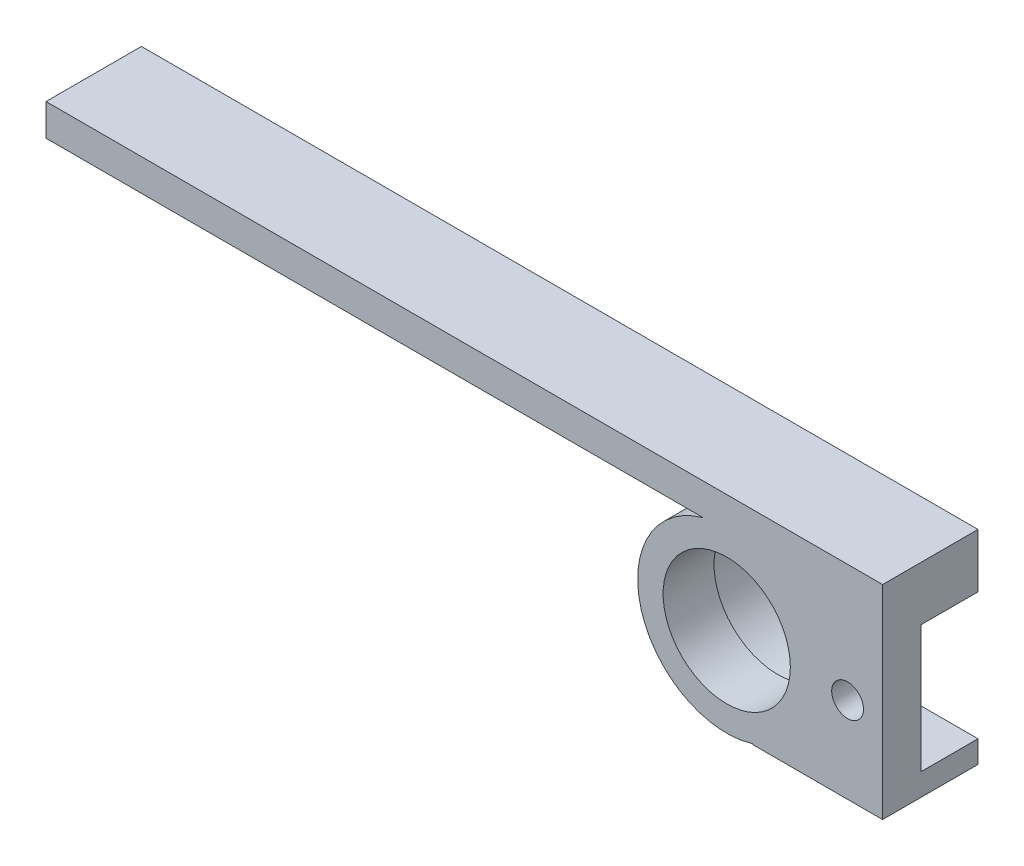
ISO-10303-21;
HEADER;
FILE_DESCRIPTION(('STEP AP214'),'2;1');
FILE_NAME('part.step','',(''),(''),'','','');
FILE_SCHEMA(('AUTOMOTIVE_DESIGN { 1 0 10303 214 1 1 1 1 }'));
ENDSEC;
DATA;
#1=APPLICATION_CONTEXT('core data for automotive mechanical design processes');
#2=APPLICATION_PROTOCOL_DEFINITION('international standard','automotive_design',2000,#1);
#3=PRODUCT_CONTEXT('',#1,'mechanical');
#4=PRODUCT('Part','Part','',(#3));
#5=PRODUCT_RELATED_PRODUCT_CATEGORY('part','',(#4));
#6=PRODUCT_DEFINITION_FORMATION('','',#4);
#7=PRODUCT_DEFINITION_CONTEXT('part definition',#1,'design');
#8=PRODUCT_DEFINITION('design','',#6,#7);
#9=PRODUCT_DEFINITION_SHAPE('','',#8);
#10=(LENGTH_UNIT() NAMED_UNIT(*) SI_UNIT(.MILLI.,.METRE.));
#11=(NAMED_UNIT(*) PLANE_ANGLE_UNIT() SI_UNIT($,.RADIAN.));
#12=(NAMED_UNIT(*) SI_UNIT($,.STERADIAN.) SOLID_ANGLE_UNIT());
#13=UNCERTAINTY_MEASURE_WITH_UNIT(LENGTH_MEASURE(1.E-05),#10,'distance_accuracy_value','');
#14=(GEOMETRIC_REPRESENTATION_CONTEXT(3) GLOBAL_UNCERTAINTY_ASSIGNED_CONTEXT((#13)) GLOBAL_UNIT_ASSIGNED_CONTEXT((#10,
#11,#12)) REPRESENTATION_CONTEXT('',''));
#15=CARTESIAN_POINT('',(0.,0.,0.));
#16=DIRECTION('',(0.,0.,1.));
#17=DIRECTION('',(1.,0.,0.));
#18=AXIS2_PLACEMENT_3D('',#15,#16,#17);
#19=CARTESIAN_POINT('',(-31.,0.,-9.));
#20=DIRECTION('',(0.,0.,1.));
#21=DIRECTION('',(1.,0.,0.));
#22=AXIS2_PLACEMENT_3D('',#19,#20,#21);
#23=CYLINDRICAL_SURFACE('',#22,11.);
#24=CARTESIAN_POINT('',(-31.,0.,-9.));
#25=DIRECTION('',(0.,0.,1.));
#26=DIRECTION('',(1.,0.,0.));
#27=AXIS2_PLACEMENT_3D('',#24,#25,#26);
#28=CIRCLE('',#27,11.);
#29=CARTESIAN_POINT('',(-20.,0.,-9.));
#30=VERTEX_POINT('',#29);
#31=EDGE_CURVE('E176',#30,#30,#28,.T.);
#32=ORIENTED_EDGE('',*,*,#31,.F.);
#33=EDGE_LOOP('',(#32));
#34=FACE_BOUND('',#33,.T.);
#35=CARTESIAN_POINT('',(-31.,0.,-2.));
#36=DIRECTION('',(0.,0.,1.));
#37=DIRECTION('',(1.,0.,0.));
#38=AXIS2_PLACEMENT_3D('',#35,#36,#37);
#39=CIRCLE('',#38,11.);
#40=CARTESIAN_POINT('',(-20.,0.,-2.));
#41=VERTEX_POINT('',#40);
#42=EDGE_CURVE('E11',#41,#41,#39,.F.);
#43=ORIENTED_EDGE('',*,*,#42,.F.);
#44=EDGE_LOOP('',(#43));
#45=FACE_BOUND('',#44,.T.);
#46=ADVANCED_FACE('F45',(#34,#45),#23,.F.);
#47=CARTESIAN_POINT('',(0.,0.,6.));
#48=DIRECTION('',(0.,0.,1.));
#49=DIRECTION('',(1.,0.,0.));
#50=AXIS2_PLACEMENT_3D('',#47,#48,#49);
#51=PLANE('',#50);
#52=DIRECTION('',(0.,1.,0.));
#53=VECTOR('',#52,1.);
#54=CARTESIAN_POINT('',(-138.015626302122,0.,6.));
#55=LINE('',#54,#53);
#56=CARTESIAN_POINT('',(-138.015626302122,13.5,6.));
#57=VERTEX_POINT('',#56);
#58=CARTESIAN_POINT('',(-138.015626302122,18.5,6.));
#59=VERTEX_POINT('',#58);
#60=EDGE_CURVE('E60',#57,#59,#55,.T.);
#61=ORIENTED_EDGE('',*,*,#60,.F.);
#62=DIRECTION('',(1.,0.,0.));
#63=VECTOR('',#62,1.);
#64=CARTESIAN_POINT('',(-480.,13.5,6.));
#65=LINE('',#64,#63);
#66=CARTESIAN_POINT('',(-34.7080992435478,13.5,6.));
#67=VERTEX_POINT('',#66);
#68=EDGE_CURVE('E161',#57,#67,#65,.T.);
#69=ORIENTED_EDGE('',*,*,#68,.T.);
#70=CARTESIAN_POINT('',(-31.,0.,6.));
#71=DIRECTION('',(0.,0.,1.));
#72=DIRECTION('',(1.,0.,0.));
#73=AXIS2_PLACEMENT_3D('',#70,#71,#72);
#74=CIRCLE('',#73,14.);
#75=CARTESIAN_POINT('',(-26.8939671408107,-13.3843376436512,6.));
#76=VERTEX_POINT('',#75);
#77=EDGE_CURVE('E173',#67,#76,#74,.T.);
#78=ORIENTED_EDGE('',*,*,#77,.T.);
#79=DIRECTION('',(0.,1.,0.));
#80=VECTOR('',#79,1.);
#81=CARTESIAN_POINT('',(-26.8939671408107,0.,6.));
#82=LINE('',#81,#80);
#83=CARTESIAN_POINT('',(-26.8939671408107,-13.5,6.));
#84=VERTEX_POINT('',#83);
#85=EDGE_CURVE('E202',#84,#76,#82,.T.);
#86=ORIENTED_EDGE('',*,*,#85,.F.);
#87=DIRECTION('',(-1.,0.,0.));
#88=VECTOR('',#87,1.);
#89=CARTESIAN_POINT('',(0.,-13.5,6.));
#90=LINE('',#89,#88);
#91=CARTESIAN_POINT('',(-6.5,-13.5,6.));
#92=VERTEX_POINT('',#91);
#93=EDGE_CURVE('E180',#92,#84,#90,.T.);
#94=ORIENTED_EDGE('',*,*,#93,.F.);
#95=DIRECTION('',(0.,-1.,0.));
#96=VECTOR('',#95,1.);
#97=CARTESIAN_POINT('',(-6.5,18.5,6.));
#98=LINE('',#97,#96);
#99=CARTESIAN_POINT('',(-6.5,18.5,6.));
#100=VERTEX_POINT('',#99);
#101=EDGE_CURVE('E363',#100,#92,#98,.T.);
#102=ORIENTED_EDGE('',*,*,#101,.F.);
#103=DIRECTION('',(1.,0.,0.));
#104=VECTOR('',#103,1.);
#105=CARTESIAN_POINT('',(-480.,18.5,6.));
#106=LINE('',#105,#104);
#107=EDGE_CURVE('E157',#59,#100,#106,.T.);
#108=ORIENTED_EDGE('',*,*,#107,.F.);
#109=EDGE_LOOP('',(#61,#69,#78,#86,#94,#102,#108));
#110=FACE_BOUND('',#109,.T.);
#111=CARTESIAN_POINT('',(-12.,-1.53625178909098E-13,6.));
#112=DIRECTION('',(0.,0.,1.));
#113=DIRECTION('',(1.,0.,0.));
#114=AXIS2_PLACEMENT_3D('',#111,#112,#113);
#115=CIRCLE('',#114,2.5);
#116=CARTESIAN_POINT('',(-9.5,-1.53625178909098E-13,6.));
#117=VERTEX_POINT('',#116);
#118=EDGE_CURVE('E224',#117,#117,#115,.T.);
#119=ORIENTED_EDGE('',*,*,#118,.F.);
#120=EDGE_LOOP('',(#119));
#121=FACE_BOUND('',#120,.T.);
#122=CARTESIAN_POINT('',(-31.,0.,6.));
#123=DIRECTION('',(0.,0.,1.));
#124=DIRECTION('',(1.,0.,0.));
#125=AXIS2_PLACEMENT_3D('',#122,#123,#124);
#126=CIRCLE('',#125,10.);
#127=CARTESIAN_POINT('',(-21.,0.,6.));
#128=VERTEX_POINT('',#127);
#129=EDGE_CURVE('E169',#128,#128,#126,.T.);
#130=ORIENTED_EDGE('',*,*,#129,.F.);
#131=EDGE_LOOP('',(#130));
#132=FACE_BOUND('',#131,.T.);
#133=ADVANCED_FACE('F278',(#110,#121,#132),#51,.T.);
#134=CARTESIAN_POINT('',(0.,0.,0.));
#135=DIRECTION('',(0.,0.,1.));
#136=DIRECTION('',(1.,0.,0.));
#137=AXIS2_PLACEMENT_3D('',#134,#135,#136);
#138=PLANE('',#137);
#139=CARTESIAN_POINT('',(-12.,-1.53625178909098E-13,0.));
#140=DIRECTION('',(0.,0.,1.));
#141=DIRECTION('',(1.,0.,0.));
#142=AXIS2_PLACEMENT_3D('',#139,#140,#141);
#143=CIRCLE('',#142,2.5);
#144=CARTESIAN_POINT('',(-9.5,-1.53625178909098E-13,0.));
#145=VERTEX_POINT('',#144);
#146=EDGE_CURVE('E209',#145,#145,#143,.T.);
#147=ORIENTED_EDGE('',*,*,#146,.T.);
#148=EDGE_LOOP('',(#147));
#149=FACE_BOUND('',#148,.T.);
#150=DIRECTION('',(-1.,0.,0.));
#151=VECTOR('',#150,1.);
#152=CARTESIAN_POINT('',(20.,10.,0.));
#153=LINE('',#152,#151);
#154=CARTESIAN_POINT('',(-6.5,10.,0.));
#155=VERTEX_POINT('',#154);
#156=CARTESIAN_POINT('',(-20.,10.,0.));
#157=VERTEX_POINT('',#156);
#158=EDGE_CURVE('E236',#155,#157,#153,.T.);
#159=ORIENTED_EDGE('',*,*,#158,.F.);
#160=DIRECTION('',(0.,-1.,0.));
#161=VECTOR('',#160,1.);
#162=CARTESIAN_POINT('',(-6.5,0.,0.));
#163=LINE('',#162,#161);
#164=CARTESIAN_POINT('',(-6.5,-10.,0.));
#165=VERTEX_POINT('',#164);
#166=EDGE_CURVE('E258',#155,#165,#163,.T.);
#167=ORIENTED_EDGE('',*,*,#166,.T.);
#168=DIRECTION('',(1.,0.,0.));
#169=VECTOR('',#168,1.);
#170=CARTESIAN_POINT('',(20.,-10.,0.));
#171=LINE('',#170,#169);
#172=CARTESIAN_POINT('',(-20.,-10.,0.));
#173=VERTEX_POINT('',#172);
#174=EDGE_CURVE('E233',#173,#165,#171,.T.);
#175=ORIENTED_EDGE('',*,*,#174,.F.);
#176=DIRECTION('',(0.,-1.,0.));
#177=VECTOR('',#176,1.);
#178=CARTESIAN_POINT('',(-20.,-10.,0.));
#179=LINE('',#178,#177);
#180=CARTESIAN_POINT('',(-20.,-8.66025403784439,0.));
#181=VERTEX_POINT('',#180);
#182=EDGE_CURVE('E227',#181,#173,#179,.T.);
#183=ORIENTED_EDGE('',*,*,#182,.F.);
#184=CARTESIAN_POINT('',(-31.,0.,0.));
#185=DIRECTION('',(0.,0.,1.));
#186=DIRECTION('',(1.,0.,0.));
#187=AXIS2_PLACEMENT_3D('',#184,#185,#186);
#188=CIRCLE('',#187,14.);
#189=CARTESIAN_POINT('',(-20.,8.66025403784439,0.));
#190=VERTEX_POINT('',#189);
#191=EDGE_CURVE('E53',#181,#190,#188,.T.);
#192=ORIENTED_EDGE('',*,*,#191,.T.);
#193=EDGE_CURVE('E230',#157,#190,#179,.T.);
#194=ORIENTED_EDGE('',*,*,#193,.F.);
#195=EDGE_LOOP('',(#159,#167,#175,#183,#192,#194));
#196=FACE_BOUND('',#195,.T.);
#197=ADVANCED_FACE('F47',(#149,#196),#138,.F.);
#198=CARTESIAN_POINT('',(-12.,-1.53625178909098E-13,0.));
#199=DIRECTION('',(0.,0.,1.));
#200=DIRECTION('',(1.,0.,0.));
#201=AXIS2_PLACEMENT_3D('',#198,#199,#200);
#202=CYLINDRICAL_SURFACE('',#201,2.5);
#203=ORIENTED_EDGE('',*,*,#146,.F.);
#204=EDGE_LOOP('',(#203));
#205=FACE_BOUND('',#204,.T.);
#206=ORIENTED_EDGE('',*,*,#118,.T.);
#207=EDGE_LOOP('',(#206));
#208=FACE_BOUND('',#207,.T.);
#209=ADVANCED_FACE('F274',(#205,#208),#202,.F.);
#210=CARTESIAN_POINT('',(-31.,0.,-9.));
#211=DIRECTION('',(0.,0.,1.));
#212=DIRECTION('',(1.,0.,0.));
#213=AXIS2_PLACEMENT_3D('',#210,#211,#212);
#214=CYLINDRICAL_SURFACE('',#213,14.);
#215=ORIENTED_EDGE('',*,*,#191,.F.);
#216=DIRECTION('',(0.,0.,1.));
#217=VECTOR('',#216,1.);
#218=CARTESIAN_POINT('',(-20.,-8.66025403784439,-9.));
#219=LINE('',#218,#217);
#220=CARTESIAN_POINT('',(-20.,-8.66025403784439,-9.));
#221=VERTEX_POINT('',#220);
#222=EDGE_CURVE('E206',#221,#181,#219,.T.);
#223=ORIENTED_EDGE('',*,*,#222,.F.);
#224=CARTESIAN_POINT('',(-31.,0.,-9.));
#225=DIRECTION('',(0.,0.,1.));
#226=DIRECTION('',(1.,0.,0.));
#227=AXIS2_PLACEMENT_3D('',#224,#225,#226);
#228=CIRCLE('',#227,14.);
#229=CARTESIAN_POINT('',(-20.,8.66025403784439,-9.));
#230=VERTEX_POINT('',#229);
#231=EDGE_CURVE('E179',#221,#230,#228,.T.);
#232=ORIENTED_EDGE('',*,*,#231,.T.);
#233=DIRECTION('',(0.,0.,1.));
#234=VECTOR('',#233,1.);
#235=CARTESIAN_POINT('',(-20.,8.66025403784439,-9.));
#236=LINE('',#235,#234);
#237=EDGE_CURVE('E200',#230,#190,#236,.T.);
#238=ORIENTED_EDGE('',*,*,#237,.T.);
#239=EDGE_LOOP('',(#215,#223,#232,#238));
#240=FACE_BOUND('',#239,.T.);
#241=ADVANCED_FACE('F248',(#240),#214,.T.);
#242=CARTESIAN_POINT('',(-20.,0.,-9.));
#243=DIRECTION('',(-1.,0.,0.));
#244=DIRECTION('',(0.,0.,1.));
#245=AXIS2_PLACEMENT_3D('',#242,#243,#244);
#246=PLANE('',#245);
#247=ORIENTED_EDGE('',*,*,#222,.T.);
#248=ORIENTED_EDGE('',*,*,#182,.T.);
#249=DIRECTION('',(0.,0.,1.));
#250=VECTOR('',#249,1.);
#251=CARTESIAN_POINT('',(-20.,-10.,-9.));
#252=LINE('',#251,#250);
#253=CARTESIAN_POINT('',(-20.,-10.,-9.));
#254=VERTEX_POINT('',#253);
#255=EDGE_CURVE('E210',#254,#173,#252,.T.);
#256=ORIENTED_EDGE('',*,*,#255,.F.);
#257=DIRECTION('',(0.,-1.,0.));
#258=VECTOR('',#257,1.);
#259=CARTESIAN_POINT('',(-20.,0.,-9.));
#260=LINE('',#259,#258);
#261=EDGE_CURVE('E197',#221,#254,#260,.T.);
#262=ORIENTED_EDGE('',*,*,#261,.F.);
#263=EDGE_LOOP('',(#247,#248,#256,#262));
#264=FACE_BOUND('',#263,.T.);
#265=ADVANCED_FACE('F265',(#264),#246,.F.);
#266=CARTESIAN_POINT('',(0.,-10.,-9.));
#267=DIRECTION('',(0.,-1.,0.));
#268=DIRECTION('',(1.,0.,0.));
#269=AXIS2_PLACEMENT_3D('',#266,#267,#268);
#270=PLANE('',#269);
#271=ORIENTED_EDGE('',*,*,#174,.T.);
#272=DIRECTION('',(0.,0.,-1.));
#273=VECTOR('',#272,1.);
#274=CARTESIAN_POINT('',(-6.5,-10.,-9.));
#275=LINE('',#274,#273);
#276=CARTESIAN_POINT('',(-6.5,-10.,-9.));
#277=VERTEX_POINT('',#276);
#278=EDGE_CURVE('E166',#165,#277,#275,.T.);
#279=ORIENTED_EDGE('',*,*,#278,.T.);
#280=DIRECTION('',(1.,0.,0.));
#281=VECTOR('',#280,1.);
#282=CARTESIAN_POINT('',(0.,-10.,-9.));
#283=LINE('',#282,#281);
#284=EDGE_CURVE('E194',#254,#277,#283,.T.);
#285=ORIENTED_EDGE('',*,*,#284,.F.);
#286=ORIENTED_EDGE('',*,*,#255,.T.);
#287=EDGE_LOOP('',(#271,#279,#285,#286));
#288=FACE_BOUND('',#287,.T.);
#289=ADVANCED_FACE('F263',(#288),#270,.F.);
#290=CARTESIAN_POINT('',(0.,10.,-9.));
#291=DIRECTION('',(0.,1.,0.));
#292=DIRECTION('',(-1.,0.,0.));
#293=AXIS2_PLACEMENT_3D('',#290,#291,#292);
#294=PLANE('',#293);
#295=DIRECTION('',(-1.,0.,0.));
#296=VECTOR('',#295,1.);
#297=CARTESIAN_POINT('',(0.,10.,-9.));
#298=LINE('',#297,#296);
#299=CARTESIAN_POINT('',(-6.5,10.,-9.));
#300=VERTEX_POINT('',#299);
#301=CARTESIAN_POINT('',(-20.,10.,-9.));
#302=VERTEX_POINT('',#301);
#303=EDGE_CURVE('E185',#300,#302,#298,.T.);
#304=ORIENTED_EDGE('',*,*,#303,.F.);
#305=DIRECTION('',(0.,0.,1.));
#306=VECTOR('',#305,1.);
#307=CARTESIAN_POINT('',(-6.5,10.,-9.));
#308=LINE('',#307,#306);
#309=EDGE_CURVE('E256',#300,#155,#308,.T.);
#310=ORIENTED_EDGE('',*,*,#309,.T.);
#311=ORIENTED_EDGE('',*,*,#158,.T.);
#312=DIRECTION('',(0.,0.,1.));
#313=VECTOR('',#312,1.);
#314=CARTESIAN_POINT('',(-20.,10.,-9.));
#315=LINE('',#314,#313);
#316=EDGE_CURVE('E219',#302,#157,#315,.T.);
#317=ORIENTED_EDGE('',*,*,#316,.F.);
#318=EDGE_LOOP('',(#304,#310,#311,#317));
#319=FACE_BOUND('',#318,.T.);
#320=ADVANCED_FACE('F254',(#319),#294,.F.);
#321=CARTESIAN_POINT('',(-20.,0.,-9.));
#322=DIRECTION('',(-1.,0.,0.));
#323=DIRECTION('',(0.,0.,1.));
#324=AXIS2_PLACEMENT_3D('',#321,#322,#323);
#325=PLANE('',#324);
#326=ORIENTED_EDGE('',*,*,#316,.T.);
#327=ORIENTED_EDGE('',*,*,#193,.T.);
#328=ORIENTED_EDGE('',*,*,#237,.F.);
#329=DIRECTION('',(0.,-1.,0.));
#330=VECTOR('',#329,1.);
#331=CARTESIAN_POINT('',(-20.,0.,-9.));
#332=LINE('',#331,#330);
#333=EDGE_CURVE('E183',#302,#230,#332,.T.);
#334=ORIENTED_EDGE('',*,*,#333,.F.);
#335=EDGE_LOOP('',(#326,#327,#328,#334));
#336=FACE_BOUND('',#335,.T.);
#337=ADVANCED_FACE('F245',(#336),#325,.F.);
#338=CARTESIAN_POINT('',(0.,-13.5,-9.));
#339=DIRECTION('',(0.,1.,0.));
#340=DIRECTION('',(0.,0.,1.));
#341=AXIS2_PLACEMENT_3D('',#338,#339,#340);
#342=PLANE('',#341);
#343=DIRECTION('',(-1.,0.,0.));
#344=VECTOR('',#343,1.);
#345=CARTESIAN_POINT('',(0.,-13.5,-9.));
#346=LINE('',#345,#344);
#347=CARTESIAN_POINT('',(-6.5,-13.5,-9.));
#348=VERTEX_POINT('',#347);
#349=CARTESIAN_POINT('',(-26.8939671408107,-13.5,-9.));
#350=VERTEX_POINT('',#349);
#351=EDGE_CURVE('E192',#348,#350,#346,.T.);
#352=ORIENTED_EDGE('',*,*,#351,.F.);
#353=DIRECTION('',(0.,0.,1.));
#354=VECTOR('',#353,1.);
#355=CARTESIAN_POINT('',(-6.5,-13.5,-9.));
#356=LINE('',#355,#354);
#357=EDGE_CURVE('E351',#348,#92,#356,.T.);
#358=ORIENTED_EDGE('',*,*,#357,.T.);
#359=ORIENTED_EDGE('',*,*,#93,.T.);
#360=DIRECTION('',(0.,0.,1.));
#361=VECTOR('',#360,1.);
#362=CARTESIAN_POINT('',(-26.8939671408107,-13.5,-9.));
#363=LINE('',#362,#361);
#364=EDGE_CURVE('E213',#350,#84,#363,.T.);
#365=ORIENTED_EDGE('',*,*,#364,.F.);
#366=EDGE_LOOP('',(#352,#358,#359,#365));
#367=FACE_BOUND('',#366,.T.);
#368=ADVANCED_FACE('F332',(#367),#342,.F.);
#369=CARTESIAN_POINT('',(-26.8939671408107,0.,-9.));
#370=DIRECTION('',(1.,0.,0.));
#371=DIRECTION('',(0.,0.,-1.));
#372=AXIS2_PLACEMENT_3D('',#369,#370,#371);
#373=PLANE('',#372);
#374=ORIENTED_EDGE('',*,*,#85,.T.);
#375=DIRECTION('',(0.,0.,1.));
#376=VECTOR('',#375,1.);
#377=CARTESIAN_POINT('',(-26.8939671408107,-13.3843376436512,-9.));
#378=LINE('',#377,#376);
#379=CARTESIAN_POINT('',(-26.8939671408107,-13.3843376436512,-9.));
#380=VERTEX_POINT('',#379);
#381=EDGE_CURVE('E216',#380,#76,#378,.T.);
#382=ORIENTED_EDGE('',*,*,#381,.F.);
#383=DIRECTION('',(0.,1.,0.));
#384=VECTOR('',#383,1.);
#385=CARTESIAN_POINT('',(-26.8939671408107,0.,-9.));
#386=LINE('',#385,#384);
#387=EDGE_CURVE('E189',#350,#380,#386,.T.);
#388=ORIENTED_EDGE('',*,*,#387,.F.);
#389=ORIENTED_EDGE('',*,*,#364,.T.);
#390=EDGE_LOOP('',(#374,#382,#388,#389));
#391=FACE_BOUND('',#390,.T.);
#392=ADVANCED_FACE('F326',(#391),#373,.F.);
#393=CARTESIAN_POINT('',(-31.,0.,-9.));
#394=DIRECTION('',(0.,0.,1.));
#395=DIRECTION('',(1.,0.,0.));
#396=AXIS2_PLACEMENT_3D('',#393,#394,#395);
#397=CYLINDRICAL_SURFACE('',#396,14.);
#398=DIRECTION('',(0.,0.,1.));
#399=VECTOR('',#398,1.);
#400=CARTESIAN_POINT('',(-34.7080992435478,13.5,-9.));
#401=LINE('',#400,#399);
#402=CARTESIAN_POINT('',(-34.7080992435478,13.5,-9.));
#403=VERTEX_POINT('',#402);
#404=EDGE_CURVE('E159',#403,#67,#401,.T.);
#405=ORIENTED_EDGE('',*,*,#404,.F.);
#406=CARTESIAN_POINT('',(-31.,0.,-9.));
#407=DIRECTION('',(0.,0.,1.));
#408=DIRECTION('',(1.,0.,0.));
#409=AXIS2_PLACEMENT_3D('',#406,#407,#408);
#410=CIRCLE('',#409,14.);
#411=EDGE_CURVE('E187',#403,#380,#410,.T.);
#412=ORIENTED_EDGE('',*,*,#411,.T.);
#413=ORIENTED_EDGE('',*,*,#381,.T.);
#414=ORIENTED_EDGE('',*,*,#77,.F.);
#415=EDGE_LOOP('',(#405,#412,#413,#414));
#416=FACE_BOUND('',#415,.T.);
#417=ADVANCED_FACE('F322',(#416),#397,.T.);
#418=CARTESIAN_POINT('',(0.,0.,-9.));
#419=DIRECTION('',(0.,0.,1.));
#420=DIRECTION('',(1.,0.,0.));
#421=AXIS2_PLACEMENT_3D('',#418,#419,#420);
#422=PLANE('',#421);
#423=DIRECTION('',(1.,0.,0.));
#424=VECTOR('',#423,1.);
#425=CARTESIAN_POINT('',(-480.,13.5,-9.));
#426=LINE('',#425,#424);
#427=CARTESIAN_POINT('',(-138.015626302122,13.5,-9.));
#428=VERTEX_POINT('',#427);
#429=EDGE_CURVE('E151',#428,#403,#426,.T.);
#430=ORIENTED_EDGE('',*,*,#429,.F.);
#431=DIRECTION('',(0.,1.,0.));
#432=VECTOR('',#431,1.);
#433=CARTESIAN_POINT('',(-138.015626302122,0.,-9.));
#434=LINE('',#433,#432);
#435=CARTESIAN_POINT('',(-138.015626302122,18.5,-9.));
#436=VERTEX_POINT('',#435);
#437=EDGE_CURVE('E141',#428,#436,#434,.T.);
#438=ORIENTED_EDGE('',*,*,#437,.T.);
#439=DIRECTION('',(1.,0.,0.));
#440=VECTOR('',#439,1.);
#441=CARTESIAN_POINT('',(-480.,18.5,-9.));
#442=LINE('',#441,#440);
#443=CARTESIAN_POINT('',(-6.50000000000001,18.5,-9.));
#444=VERTEX_POINT('',#443);
#445=EDGE_CURVE('E68',#436,#444,#442,.T.);
#446=ORIENTED_EDGE('',*,*,#445,.T.);
#447=DIRECTION('',(0.,-1.,0.));
#448=VECTOR('',#447,1.);
#449=CARTESIAN_POINT('',(-6.5,18.5,-9.));
#450=LINE('',#449,#448);
#451=EDGE_CURVE('E364',#444,#300,#450,.T.);
#452=ORIENTED_EDGE('',*,*,#451,.T.);
#453=ORIENTED_EDGE('',*,*,#303,.T.);
#454=ORIENTED_EDGE('',*,*,#333,.T.);
#455=ORIENTED_EDGE('',*,*,#231,.F.);
#456=ORIENTED_EDGE('',*,*,#261,.T.);
#457=ORIENTED_EDGE('',*,*,#284,.T.);
#458=EDGE_CURVE('E356',#277,#348,#450,.T.);
#459=ORIENTED_EDGE('',*,*,#458,.T.);
#460=ORIENTED_EDGE('',*,*,#351,.T.);
#461=ORIENTED_EDGE('',*,*,#387,.T.);
#462=ORIENTED_EDGE('',*,*,#411,.F.);
#463=EDGE_LOOP('',(#430,#438,#446,#452,#453,#454,#455,#456,#457,#459,#460,#461,#462));
#464=FACE_BOUND('',#463,.T.);
#465=ORIENTED_EDGE('',*,*,#31,.T.);
#466=EDGE_LOOP('',(#465));
#467=FACE_BOUND('',#466,.T.);
#468=ADVANCED_FACE('F148',(#464,#467),#422,.F.);
#469=CARTESIAN_POINT('',(-31.,0.,-2.));
#470=DIRECTION('',(0.,0.,1.));
#471=DIRECTION('',(1.,0.,0.));
#472=AXIS2_PLACEMENT_3D('',#469,#470,#471);
#473=PLANE('',#472);
#474=CARTESIAN_POINT('',(-31.,0.,-2.));
#475=DIRECTION('',(0.,0.,1.));
#476=DIRECTION('',(1.,0.,0.));
#477=AXIS2_PLACEMENT_3D('',#474,#475,#476);
#478=CIRCLE('',#477,10.);
#479=CARTESIAN_POINT('',(-21.,0.,-2.));
#480=VERTEX_POINT('',#479);
#481=EDGE_CURVE('E170',#480,#480,#478,.T.);
#482=ORIENTED_EDGE('',*,*,#481,.T.);
#483=EDGE_LOOP('',(#482));
#484=FACE_BOUND('',#483,.T.);
#485=ORIENTED_EDGE('',*,*,#42,.T.);
#486=EDGE_LOOP('',(#485));
#487=FACE_BOUND('',#486,.T.);
#488=ADVANCED_FACE('F307',(#484,#487),#473,.F.);
#489=CARTESIAN_POINT('',(-31.,0.,-2.));
#490=DIRECTION('',(0.,0.,1.));
#491=DIRECTION('',(1.,0.,0.));
#492=AXIS2_PLACEMENT_3D('',#489,#490,#491);
#493=CYLINDRICAL_SURFACE('',#492,10.);
#494=ORIENTED_EDGE('',*,*,#481,.F.);
#495=EDGE_LOOP('',(#494));
#496=FACE_BOUND('',#495,.T.);
#497=ORIENTED_EDGE('',*,*,#129,.T.);
#498=EDGE_LOOP('',(#497));
#499=FACE_BOUND('',#498,.T.);
#500=ADVANCED_FACE('F304',(#496,#499),#493,.F.);
#501=CARTESIAN_POINT('',(-480.,13.5,6.));
#502=DIRECTION('',(0.,-1.,0.));
#503=DIRECTION('',(0.,0.,-1.));
#504=AXIS2_PLACEMENT_3D('',#501,#502,#503);
#505=PLANE('',#504);
#506=DIRECTION('',(0.,0.,1.));
#507=VECTOR('',#506,1.);
#508=CARTESIAN_POINT('',(-138.015626302122,13.5,6.));
#509=LINE('',#508,#507);
#510=EDGE_CURVE('E145',#428,#57,#509,.T.);
#511=ORIENTED_EDGE('',*,*,#510,.F.);
#512=ORIENTED_EDGE('',*,*,#429,.T.);
#513=ORIENTED_EDGE('',*,*,#404,.T.);
#514=ORIENTED_EDGE('',*,*,#68,.F.);
#515=EDGE_LOOP('',(#511,#512,#513,#514));
#516=FACE_BOUND('',#515,.T.);
#517=ADVANCED_FACE('F306',(#516),#505,.T.);
#518=CARTESIAN_POINT('',(-480.,18.5,6.));
#519=DIRECTION('',(0.,1.,0.));
#520=DIRECTION('',(0.,0.,1.));
#521=AXIS2_PLACEMENT_3D('',#518,#519,#520);
#522=PLANE('',#521);
#523=DIRECTION('',(0.,0.,-1.));
#524=VECTOR('',#523,1.);
#525=CARTESIAN_POINT('',(-138.015626302122,18.5,6.01392640061971));
#526=LINE('',#525,#524);
#527=EDGE_CURVE('E139',#59,#436,#526,.T.);
#528=ORIENTED_EDGE('',*,*,#527,.F.);
#529=ORIENTED_EDGE('',*,*,#107,.T.);
#530=DIRECTION('',(0.,0.,1.));
#531=VECTOR('',#530,1.);
#532=CARTESIAN_POINT('',(-6.5,18.5,-9.));
#533=LINE('',#532,#531);
#534=EDGE_CURVE('E156',#444,#100,#533,.T.);
#535=ORIENTED_EDGE('',*,*,#534,.F.);
#536=ORIENTED_EDGE('',*,*,#445,.F.);
#537=EDGE_LOOP('',(#528,#529,#535,#536));
#538=FACE_BOUND('',#537,.T.);
#539=ADVANCED_FACE('F154',(#538),#522,.T.);
#540=CARTESIAN_POINT('',(-6.5,18.5,-9.));
#541=DIRECTION('',(-1.,0.,0.));
#542=DIRECTION('',(0.,0.,1.));
#543=AXIS2_PLACEMENT_3D('',#540,#541,#542);
#544=PLANE('',#543);
#545=ORIENTED_EDGE('',*,*,#166,.F.);
#546=ORIENTED_EDGE('',*,*,#309,.F.);
#547=ORIENTED_EDGE('',*,*,#451,.F.);
#548=ORIENTED_EDGE('',*,*,#534,.T.);
#549=ORIENTED_EDGE('',*,*,#101,.T.);
#550=ORIENTED_EDGE('',*,*,#357,.F.);
#551=ORIENTED_EDGE('',*,*,#458,.F.);
#552=ORIENTED_EDGE('',*,*,#278,.F.);
#553=EDGE_LOOP('',(#545,#546,#547,#548,#549,#550,#551,#552));
#554=FACE_BOUND('',#553,.T.);
#555=ADVANCED_FACE('F370',(#554),#544,.F.);
#556=CARTESIAN_POINT('',(-138.015626302122,-14.,6.01392640061971));
#557=DIRECTION('',(1.,0.,0.));
#558=DIRECTION('',(0.,0.,-1.));
#559=AXIS2_PLACEMENT_3D('',#556,#557,#558);
#560=PLANE('',#559);
#561=ORIENTED_EDGE('',*,*,#60,.T.);
#562=ORIENTED_EDGE('',*,*,#527,.T.);
#563=ORIENTED_EDGE('',*,*,#437,.F.);
#564=ORIENTED_EDGE('',*,*,#510,.T.);
#565=EDGE_LOOP('',(#561,#562,#563,#564));
#566=FACE_BOUND('',#565,.T.);
#567=ADVANCED_FACE('F140',(#566),#560,.F.);
#568=CLOSED_SHELL('',(#46,#133,#197,#209,#241,#265,#289,#320,#337,#368,#392,#417,#468,#488,#500,
#517,#539,#555,#567));
#569=MANIFOLD_SOLID_BREP('B2',#568);
#570=ADVANCED_BREP_SHAPE_REPRESENTATION('',(#18,#569),#14);
#571=SHAPE_DEFINITION_REPRESENTATION(#9,#570);
ENDSEC;
END-ISO-10303-21;
